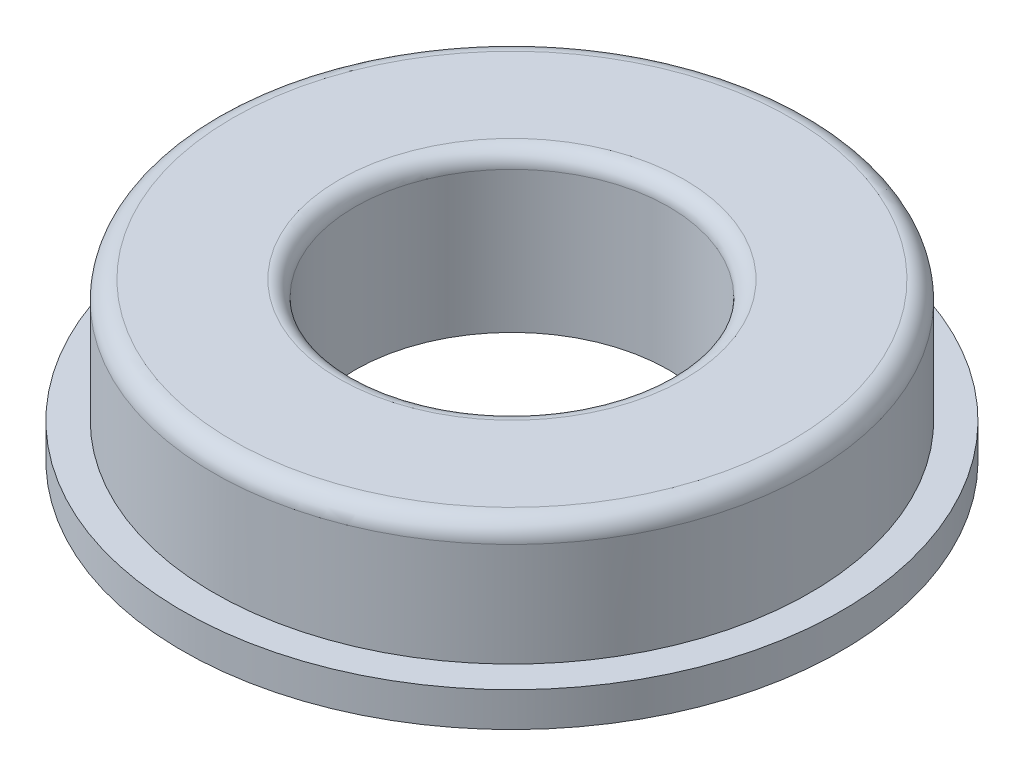
ISO-10303-21;
HEADER;
FILE_DESCRIPTION(('STEP AP214'),'2;1');
FILE_NAME('part.step','',(''),(''),'','','');
FILE_SCHEMA(('AUTOMOTIVE_DESIGN { 1 0 10303 214 1 1 1 1 }'));
ENDSEC;
DATA;
#1=APPLICATION_CONTEXT('core data for automotive mechanical design processes');
#2=APPLICATION_PROTOCOL_DEFINITION('international standard','automotive_design',2000,#1);
#3=PRODUCT_CONTEXT('',#1,'mechanical');
#4=PRODUCT('Part','Part','',(#3));
#5=PRODUCT_RELATED_PRODUCT_CATEGORY('part','',(#4));
#6=PRODUCT_DEFINITION_FORMATION('','',#4);
#7=PRODUCT_DEFINITION_CONTEXT('part definition',#1,'design');
#8=PRODUCT_DEFINITION('design','',#6,#7);
#9=PRODUCT_DEFINITION_SHAPE('','',#8);
#10=(LENGTH_UNIT() NAMED_UNIT(*) SI_UNIT(.MILLI.,.METRE.));
#11=(NAMED_UNIT(*) PLANE_ANGLE_UNIT() SI_UNIT($,.RADIAN.));
#12=(NAMED_UNIT(*) SI_UNIT($,.STERADIAN.) SOLID_ANGLE_UNIT());
#13=UNCERTAINTY_MEASURE_WITH_UNIT(LENGTH_MEASURE(1.E-05),#10,'distance_accuracy_value','');
#14=(GEOMETRIC_REPRESENTATION_CONTEXT(3) GLOBAL_UNCERTAINTY_ASSIGNED_CONTEXT((#13)) GLOBAL_UNIT_ASSIGNED_CONTEXT((#10,
#11,#12)) REPRESENTATION_CONTEXT('',''));
#15=CARTESIAN_POINT('',(0.,0.,0.));
#16=DIRECTION('',(0.,0.,1.));
#17=DIRECTION('',(1.,0.,0.));
#18=AXIS2_PLACEMENT_3D('',#15,#16,#17);
#19=CARTESIAN_POINT('',(-5.,0.,0.));
#20=DIRECTION('',(0.,1.,0.));
#21=DIRECTION('',(-1.,0.,0.));
#22=AXIS2_PLACEMENT_3D('',#19,#20,#21);
#23=CYLINDRICAL_SURFACE('',#22,5.);
#24=CARTESIAN_POINT('',(-5.,-0.500000000000002,0.));
#25=DIRECTION('',(0.,-1.,0.));
#26=DIRECTION('',(1.,0.,0.));
#27=AXIS2_PLACEMENT_3D('',#24,#25,#26);
#28=CIRCLE('',#27,5.);
#29=CARTESIAN_POINT('',(0.,-0.500000000000001,0.));
#30=VERTEX_POINT('',#29);
#31=EDGE_CURVE('E41',#30,#30,#28,.F.);
#32=ORIENTED_EDGE('',*,*,#31,.T.);
#33=EDGE_LOOP('',(#32));
#34=FACE_BOUND('',#33,.T.);
#35=CARTESIAN_POINT('',(-5.,-5.,0.));
#36=DIRECTION('',(0.,1.,0.));
#37=DIRECTION('',(-1.,0.,0.));
#38=AXIS2_PLACEMENT_3D('',#35,#36,#37);
#39=CIRCLE('',#38,5.);
#40=CARTESIAN_POINT('',(-10.,-5.,0.));
#41=VERTEX_POINT('',#40);
#42=EDGE_CURVE('E63',#41,#41,#39,.T.);
#43=ORIENTED_EDGE('',*,*,#42,.F.);
#44=EDGE_LOOP('',(#43));
#45=FACE_BOUND('',#44,.T.);
#46=ADVANCED_FACE('F34',(#34,#45),#23,.F.);
#47=CARTESIAN_POINT('',(0.,0.,0.));
#48=DIRECTION('',(0.,-1.,0.));
#49=DIRECTION('',(1.,0.,0.));
#50=AXIS2_PLACEMENT_3D('',#47,#48,#49);
#51=PLANE('',#50);
#52=CARTESIAN_POINT('',(-5.,0.,0.));
#53=DIRECTION('',(0.,-1.,0.));
#54=DIRECTION('',(1.,0.,0.));
#55=AXIS2_PLACEMENT_3D('',#52,#53,#54);
#56=CIRCLE('',#55,5.5);
#57=CARTESIAN_POINT('',(0.5,0.,0.));
#58=VERTEX_POINT('',#57);
#59=EDGE_CURVE('E10',#58,#58,#56,.T.);
#60=ORIENTED_EDGE('',*,*,#59,.T.);
#61=EDGE_LOOP('',(#60));
#62=FACE_BOUND('',#61,.T.);
#63=CARTESIAN_POINT('',(-5.,0.,0.));
#64=DIRECTION('',(0.,-1.,0.));
#65=DIRECTION('',(1.,0.,0.));
#66=AXIS2_PLACEMENT_3D('',#63,#64,#65);
#67=CIRCLE('',#66,8.9);
#68=CARTESIAN_POINT('',(3.9,0.,0.));
#69=VERTEX_POINT('',#68);
#70=EDGE_CURVE('E49',#69,#69,#67,.F.);
#71=ORIENTED_EDGE('',*,*,#70,.T.);
#72=EDGE_LOOP('',(#71));
#73=FACE_BOUND('',#72,.T.);
#74=ADVANCED_FACE('F70',(#62,#73),#51,.F.);
#75=CARTESIAN_POINT('',(-5.,0.,0.));
#76=DIRECTION('',(0.,1.,0.));
#77=DIRECTION('',(-1.,0.,0.));
#78=AXIS2_PLACEMENT_3D('',#75,#76,#77);
#79=CYLINDRICAL_SURFACE('',#78,9.5);
#80=CARTESIAN_POINT('',(-5.,-0.600000000000002,0.));
#81=DIRECTION('',(0.,-1.,0.));
#82=DIRECTION('',(1.,0.,0.));
#83=AXIS2_PLACEMENT_3D('',#80,#81,#82);
#84=CIRCLE('',#83,9.5);
#85=CARTESIAN_POINT('',(4.5,-0.599999999999999,0.));
#86=VERTEX_POINT('',#85);
#87=EDGE_CURVE('E45',#86,#86,#84,.T.);
#88=ORIENTED_EDGE('',*,*,#87,.T.);
#89=EDGE_LOOP('',(#88));
#90=FACE_BOUND('',#89,.T.);
#91=CARTESIAN_POINT('',(-5.,-3.9,0.));
#92=DIRECTION('',(0.,1.,0.));
#93=DIRECTION('',(-1.,0.,0.));
#94=AXIS2_PLACEMENT_3D('',#91,#92,#93);
#95=CIRCLE('',#94,9.5);
#96=CARTESIAN_POINT('',(-14.5,-3.9,0.));
#97=VERTEX_POINT('',#96);
#98=EDGE_CURVE('E54',#97,#97,#95,.T.);
#99=ORIENTED_EDGE('',*,*,#98,.T.);
#100=EDGE_LOOP('',(#99));
#101=FACE_BOUND('',#100,.T.);
#102=ADVANCED_FACE('F75',(#90,#101),#79,.T.);
#103=CARTESIAN_POINT('',(4.5,-3.9,0.));
#104=DIRECTION('',(0.,-1.,0.));
#105=DIRECTION('',(1.,0.,0.));
#106=AXIS2_PLACEMENT_3D('',#103,#104,#105);
#107=PLANE('',#106);
#108=ORIENTED_EDGE('',*,*,#98,.F.);
#109=EDGE_LOOP('',(#108));
#110=FACE_BOUND('',#109,.T.);
#111=CARTESIAN_POINT('',(-5.,-3.9,0.));
#112=DIRECTION('',(0.,1.,0.));
#113=DIRECTION('',(-1.,0.,0.));
#114=AXIS2_PLACEMENT_3D('',#111,#112,#113);
#115=CIRCLE('',#114,10.5);
#116=CARTESIAN_POINT('',(-15.5,-3.90000000000001,0.));
#117=VERTEX_POINT('',#116);
#118=EDGE_CURVE('E57',#117,#117,#115,.T.);
#119=ORIENTED_EDGE('',*,*,#118,.T.);
#120=EDGE_LOOP('',(#119));
#121=FACE_BOUND('',#120,.T.);
#122=ADVANCED_FACE('F96',(#110,#121),#107,.F.);
#123=CARTESIAN_POINT('',(-5.,0.,0.));
#124=DIRECTION('',(0.,1.,0.));
#125=DIRECTION('',(-1.,0.,0.));
#126=AXIS2_PLACEMENT_3D('',#123,#124,#125);
#127=CYLINDRICAL_SURFACE('',#126,10.5);
#128=ORIENTED_EDGE('',*,*,#118,.F.);
#129=EDGE_LOOP('',(#128));
#130=FACE_BOUND('',#129,.T.);
#131=CARTESIAN_POINT('',(-5.,-5.,0.));
#132=DIRECTION('',(0.,1.,0.));
#133=DIRECTION('',(-1.,0.,0.));
#134=AXIS2_PLACEMENT_3D('',#131,#132,#133);
#135=CIRCLE('',#134,10.5);
#136=CARTESIAN_POINT('',(-15.5,-5.00000000000001,0.));
#137=VERTEX_POINT('',#136);
#138=EDGE_CURVE('E60',#137,#137,#135,.T.);
#139=ORIENTED_EDGE('',*,*,#138,.T.);
#140=EDGE_LOOP('',(#139));
#141=FACE_BOUND('',#140,.T.);
#142=ADVANCED_FACE('F86',(#130,#141),#127,.T.);
#143=CARTESIAN_POINT('',(5.5,-5.,0.));
#144=DIRECTION('',(0.,1.,0.));
#145=DIRECTION('',(-1.,0.,0.));
#146=AXIS2_PLACEMENT_3D('',#143,#144,#145);
#147=PLANE('',#146);
#148=ORIENTED_EDGE('',*,*,#138,.F.);
#149=EDGE_LOOP('',(#148));
#150=FACE_BOUND('',#149,.T.);
#151=ORIENTED_EDGE('',*,*,#42,.T.);
#152=EDGE_LOOP('',(#151));
#153=FACE_BOUND('',#152,.T.);
#154=ADVANCED_FACE('F67',(#150,#153),#147,.F.);
#155=CARTESIAN_POINT('',(-5.,-0.600000000000002,0.));
#156=DIRECTION('',(0.,-1.,0.));
#157=DIRECTION('',(1.,0.,0.));
#158=AXIS2_PLACEMENT_3D('',#155,#156,#157);
#159=TOROIDAL_SURFACE('',#158,8.9,0.6);
#160=ORIENTED_EDGE('',*,*,#87,.F.);
#161=EDGE_LOOP('',(#160));
#162=FACE_BOUND('',#161,.T.);
#163=ORIENTED_EDGE('',*,*,#70,.F.);
#164=EDGE_LOOP('',(#163));
#165=FACE_BOUND('',#164,.T.);
#166=ADVANCED_FACE('F78',(#162,#165),#159,.T.);
#167=CARTESIAN_POINT('',(-5.,-0.500000000000002,0.));
#168=DIRECTION('',(0.,-1.,0.));
#169=DIRECTION('',(1.,0.,0.));
#170=AXIS2_PLACEMENT_3D('',#167,#168,#169);
#171=TOROIDAL_SURFACE('',#170,5.5,0.5);
#172=ORIENTED_EDGE('',*,*,#59,.F.);
#173=EDGE_LOOP('',(#172));
#174=FACE_BOUND('',#173,.T.);
#175=ORIENTED_EDGE('',*,*,#31,.F.);
#176=EDGE_LOOP('',(#175));
#177=FACE_BOUND('',#176,.T.);
#178=ADVANCED_FACE('F36',(#174,#177),#171,.T.);
#179=CLOSED_SHELL('',(#46,#74,#102,#122,#142,#154,#166,#178));
#180=MANIFOLD_SOLID_BREP('B2',#179);
#181=ADVANCED_BREP_SHAPE_REPRESENTATION('',(#18,#180),#14);
#182=SHAPE_DEFINITION_REPRESENTATION(#9,#181);
ENDSEC;
END-ISO-10303-21;
